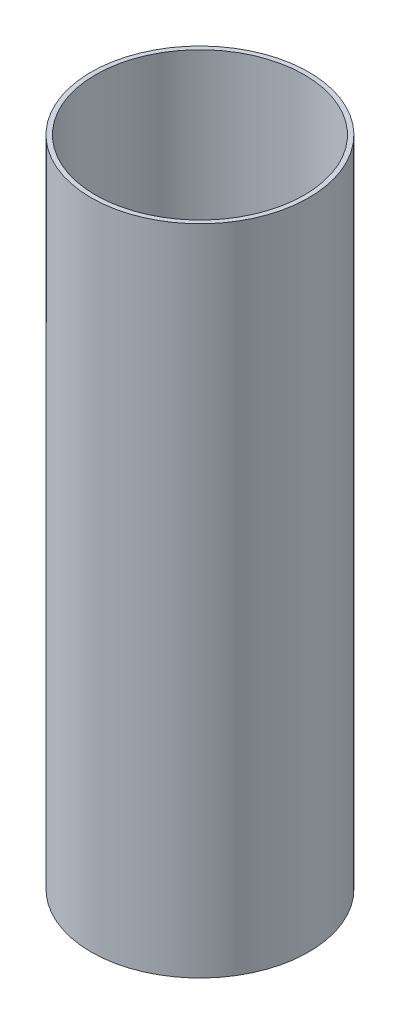
ISO-10303-21;
HEADER;
FILE_DESCRIPTION(('STEP AP214'),'2;1');
FILE_NAME('part.step','',(''),(''),'','','');
FILE_SCHEMA(('AUTOMOTIVE_DESIGN { 1 0 10303 214 1 1 1 1 }'));
ENDSEC;
DATA;
#1=APPLICATION_CONTEXT('core data for automotive mechanical design processes');
#2=APPLICATION_PROTOCOL_DEFINITION('international standard','automotive_design',2000,#1);
#3=PRODUCT_CONTEXT('',#1,'mechanical');
#4=PRODUCT('Part','Part','',(#3));
#5=PRODUCT_RELATED_PRODUCT_CATEGORY('part','',(#4));
#6=PRODUCT_DEFINITION_FORMATION('','',#4);
#7=PRODUCT_DEFINITION_CONTEXT('part definition',#1,'design');
#8=PRODUCT_DEFINITION('design','',#6,#7);
#9=PRODUCT_DEFINITION_SHAPE('','',#8);
#10=(LENGTH_UNIT() NAMED_UNIT(*) SI_UNIT(.MILLI.,.METRE.));
#11=(NAMED_UNIT(*) PLANE_ANGLE_UNIT() SI_UNIT($,.RADIAN.));
#12=(NAMED_UNIT(*) SI_UNIT($,.STERADIAN.) SOLID_ANGLE_UNIT());
#13=UNCERTAINTY_MEASURE_WITH_UNIT(LENGTH_MEASURE(1.E-05),#10,'distance_accuracy_value','');
#14=(GEOMETRIC_REPRESENTATION_CONTEXT(3) GLOBAL_UNCERTAINTY_ASSIGNED_CONTEXT((#13)) GLOBAL_UNIT_ASSIGNED_CONTEXT((#10,
#11,#12)) REPRESENTATION_CONTEXT('',''));
#15=CARTESIAN_POINT('',(0.,0.,0.));
#16=DIRECTION('',(0.,0.,1.));
#17=DIRECTION('',(1.,0.,0.));
#18=AXIS2_PLACEMENT_3D('',#15,#16,#17);
#19=CARTESIAN_POINT('',(0.,457.2,0.));
#20=DIRECTION('',(0.,1.,0.));
#21=DIRECTION('',(0.,0.,1.));
#22=AXIS2_PLACEMENT_3D('',#19,#20,#21);
#23=PLANE('',#22);
#24=CARTESIAN_POINT('',(0.,457.2,0.));
#25=DIRECTION('',(0.,1.,0.));
#26=DIRECTION('',(0.,0.,1.));
#27=AXIS2_PLACEMENT_3D('',#24,#25,#26);
#28=CIRCLE('',#27,76.2);
#29=CARTESIAN_POINT('',(0.,457.2,76.2));
#30=VERTEX_POINT('',#29);
#31=EDGE_CURVE('E10',#30,#30,#28,.T.);
#32=ORIENTED_EDGE('',*,*,#31,.T.);
#33=EDGE_LOOP('',(#32));
#34=FACE_BOUND('',#33,.T.);
#35=CARTESIAN_POINT('',(0.,457.2,0.));
#36=DIRECTION('',(0.,1.,0.));
#37=DIRECTION('',(0.,0.,1.));
#38=AXIS2_PLACEMENT_3D('',#35,#36,#37);
#39=CIRCLE('',#38,73.025);
#40=CARTESIAN_POINT('',(0.,457.2,73.025));
#41=VERTEX_POINT('',#40);
#42=EDGE_CURVE('E50',#41,#41,#39,.T.);
#43=ORIENTED_EDGE('',*,*,#42,.F.);
#44=EDGE_LOOP('',(#43));
#45=FACE_BOUND('',#44,.T.);
#46=ADVANCED_FACE('F37',(#34,#45),#23,.T.);
#47=CARTESIAN_POINT('',(0.,0.,0.));
#48=DIRECTION('',(0.,1.,0.));
#49=DIRECTION('',(0.,0.,1.));
#50=AXIS2_PLACEMENT_3D('',#47,#48,#49);
#51=PLANE('',#50);
#52=CARTESIAN_POINT('',(0.,0.,0.));
#53=DIRECTION('',(0.,1.,0.));
#54=DIRECTION('',(0.,0.,1.));
#55=AXIS2_PLACEMENT_3D('',#52,#53,#54);
#56=CIRCLE('',#55,76.2);
#57=CARTESIAN_POINT('',(0.,0.,76.2));
#58=VERTEX_POINT('',#57);
#59=EDGE_CURVE('E41',#58,#58,#56,.T.);
#60=ORIENTED_EDGE('',*,*,#59,.F.);
#61=EDGE_LOOP('',(#60));
#62=FACE_BOUND('',#61,.T.);
#63=CARTESIAN_POINT('',(0.,0.,0.));
#64=DIRECTION('',(0.,1.,0.));
#65=DIRECTION('',(0.,0.,1.));
#66=AXIS2_PLACEMENT_3D('',#63,#64,#65);
#67=CIRCLE('',#66,73.025);
#68=CARTESIAN_POINT('',(0.,0.,73.025));
#69=VERTEX_POINT('',#68);
#70=EDGE_CURVE('E52',#69,#69,#67,.T.);
#71=ORIENTED_EDGE('',*,*,#70,.T.);
#72=EDGE_LOOP('',(#71));
#73=FACE_BOUND('',#72,.T.);
#74=ADVANCED_FACE('F64',(#62,#73),#51,.F.);
#75=CARTESIAN_POINT('',(0.,457.2,0.));
#76=DIRECTION('',(0.,-1.,0.));
#77=DIRECTION('',(0.,0.,-1.));
#78=AXIS2_PLACEMENT_3D('',#75,#76,#77);
#79=CYLINDRICAL_SURFACE('',#78,76.2);
#80=ORIENTED_EDGE('',*,*,#31,.F.);
#81=EDGE_LOOP('',(#80));
#82=FACE_BOUND('',#81,.T.);
#83=ORIENTED_EDGE('',*,*,#59,.T.);
#84=EDGE_LOOP('',(#83));
#85=FACE_BOUND('',#84,.T.);
#86=ADVANCED_FACE('F39',(#82,#85),#79,.T.);
#87=CARTESIAN_POINT('',(0.,457.2,0.));
#88=DIRECTION('',(0.,-1.,0.));
#89=DIRECTION('',(0.,0.,-1.));
#90=AXIS2_PLACEMENT_3D('',#87,#88,#89);
#91=CYLINDRICAL_SURFACE('',#90,73.025);
#92=ORIENTED_EDGE('',*,*,#42,.T.);
#93=EDGE_LOOP('',(#92));
#94=FACE_BOUND('',#93,.T.);
#95=ORIENTED_EDGE('',*,*,#70,.F.);
#96=EDGE_LOOP('',(#95));
#97=FACE_BOUND('',#96,.T.);
#98=ADVANCED_FACE('F60',(#94,#97),#91,.F.);
#99=CLOSED_SHELL('',(#46,#74,#86,#98));
#100=MANIFOLD_SOLID_BREP('B2',#99);
#101=ADVANCED_BREP_SHAPE_REPRESENTATION('',(#18,#100),#14);
#102=SHAPE_DEFINITION_REPRESENTATION(#9,#101);
ENDSEC;
END-ISO-10303-21;
